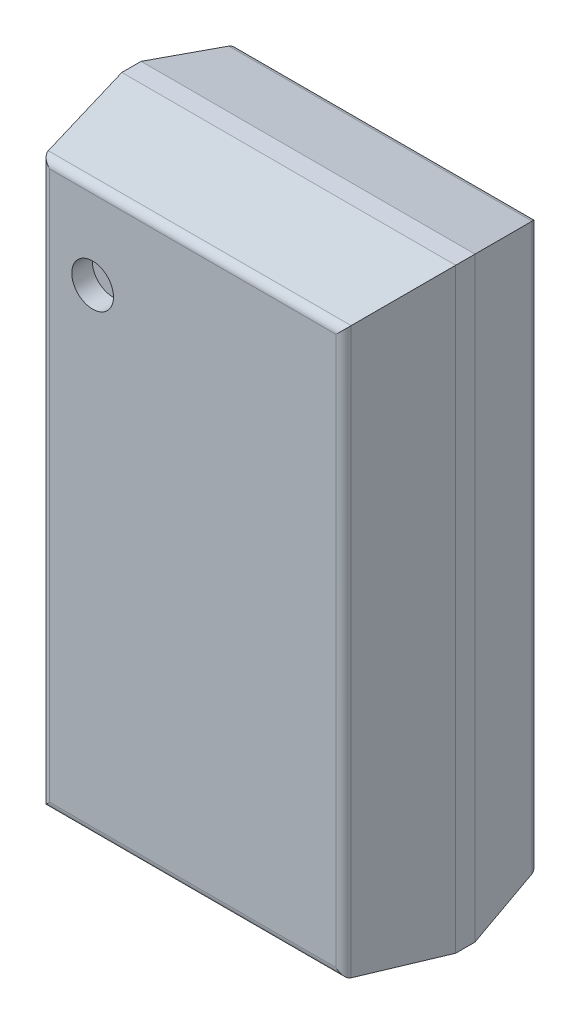
ISO-10303-21;
HEADER;
FILE_DESCRIPTION(('STEP AP214'),'2;1');
FILE_NAME('part.step','',(''),(''),'','','');
FILE_SCHEMA(('AUTOMOTIVE_DESIGN { 1 0 10303 214 1 1 1 1 }'));
ENDSEC;
DATA;
#1=APPLICATION_CONTEXT('core data for automotive mechanical design processes');
#2=APPLICATION_PROTOCOL_DEFINITION('international standard','automotive_design',2000,#1);
#3=PRODUCT_CONTEXT('',#1,'mechanical');
#4=PRODUCT('Part','Part','',(#3));
#5=PRODUCT_RELATED_PRODUCT_CATEGORY('part','',(#4));
#6=PRODUCT_DEFINITION_FORMATION('','',#4);
#7=PRODUCT_DEFINITION_CONTEXT('part definition',#1,'design');
#8=PRODUCT_DEFINITION('design','',#6,#7);
#9=PRODUCT_DEFINITION_SHAPE('','',#8);
#10=(LENGTH_UNIT() NAMED_UNIT(*) SI_UNIT(.MILLI.,.METRE.));
#11=(NAMED_UNIT(*) PLANE_ANGLE_UNIT() SI_UNIT($,.RADIAN.));
#12=(NAMED_UNIT(*) SI_UNIT($,.STERADIAN.) SOLID_ANGLE_UNIT());
#13=UNCERTAINTY_MEASURE_WITH_UNIT(LENGTH_MEASURE(1.E-05),#10,'distance_accuracy_value','');
#14=(GEOMETRIC_REPRESENTATION_CONTEXT(3) GLOBAL_UNCERTAINTY_ASSIGNED_CONTEXT((#13)) GLOBAL_UNIT_ASSIGNED_CONTEXT((#10,
#11,#12)) REPRESENTATION_CONTEXT('',''));
#15=CARTESIAN_POINT('',(0.,0.,0.));
#16=DIRECTION('',(0.,0.,1.));
#17=DIRECTION('',(1.,0.,0.));
#18=AXIS2_PLACEMENT_3D('',#15,#16,#17);
#19=CARTESIAN_POINT('',(-0.771875,-1.45,0.247083911324));
#20=DIRECTION('',(-0.978358092019797,0.,-0.206918930451957));
#21=DIRECTION('',(0.,1.,0.));
#22=AXIS2_PLACEMENT_3D('',#19,#20,#21);
#23=PLANE('',#22);
#24=DIRECTION('',(0.20262661892508,0.20262661892508,-0.958063101578378));
#25=VECTOR('',#24,1.);
#26=CARTESIAN_POINT('',(-0.773542962835,-1.411042962835,0.254970405483));
#27=LINE('',#26,#25);
#28=CARTESIAN_POINT('',(-0.8125,-1.45,0.439167822649));
#29=VERTEX_POINT('',#28);
#30=CARTESIAN_POINT('',(-0.738064175914,-1.375564175914,0.08721891845039));
#31=VERTEX_POINT('',#30);
#32=EDGE_CURVE('E11',#29,#31,#27,.T.);
#33=ORIENTED_EDGE('',*,*,#32,.F.);
#34=DIRECTION('',(0.,1.,0.));
#35=VECTOR('',#34,1.);
#36=CARTESIAN_POINT('',(-0.8125,-1.45,0.439167822649));
#37=LINE('',#36,#35);
#38=CARTESIAN_POINT('',(-0.8125,1.45,0.439167822649));
#39=VERTEX_POINT('',#38);
#40=EDGE_CURVE('E24',#29,#39,#37,.T.);
#41=ORIENTED_EDGE('',*,*,#40,.T.);
#42=DIRECTION('',(0.20262661892508,-0.20262661892508,-0.958063101578378));
#43=VECTOR('',#42,1.);
#44=CARTESIAN_POINT('',(-0.714009520124,1.351509520124,-0.0265167706519));
#45=LINE('',#44,#43);
#46=CARTESIAN_POINT('',(-0.738064175914,1.375564175914,0.08721891845039));
#47=VERTEX_POINT('',#46);
#48=EDGE_CURVE('E223',#39,#47,#45,.T.);
#49=ORIENTED_EDGE('',*,*,#48,.T.);
#50=DIRECTION('',(0.,1.,0.));
#51=VECTOR('',#50,1.);
#52=CARTESIAN_POINT('',(-0.738064175914,-1.36875,0.08721891845039));
#53=LINE('',#52,#51);
#54=EDGE_CURVE('E220',#31,#47,#53,.T.);
#55=ORIENTED_EDGE('',*,*,#54,.F.);
#56=EDGE_LOOP('',(#33,#41,#49,#55));
#57=FACE_BOUND('',#56,.T.);
#58=ADVANCED_FACE('F17',(#57),#23,.T.);
#59=CARTESIAN_POINT('',(-0.8125,-1.409375,0.247083911324));
#60=DIRECTION('',(0.,-0.978358092019797,-0.206918930451957));
#61=DIRECTION('',(-1.,0.,0.));
#62=AXIS2_PLACEMENT_3D('',#59,#60,#61);
#63=PLANE('',#62);
#64=DIRECTION('',(1.,0.,0.));
#65=VECTOR('',#64,1.);
#66=CARTESIAN_POINT('',(-0.73125,-1.375564175914,0.08721891845039));
#67=LINE('',#66,#65);
#68=CARTESIAN_POINT('',(0.738064175914,-1.375564175914,0.08721891845039));
#69=VERTEX_POINT('',#68);
#70=EDGE_CURVE('E218',#31,#69,#67,.T.);
#71=ORIENTED_EDGE('',*,*,#70,.T.);
#72=DIRECTION('',(-0.20262661892508,0.20262661892508,-0.958063101578378));
#73=VECTOR('',#72,1.);
#74=CARTESIAN_POINT('',(0.740183706143,-1.377683706143,0.09724052230414));
#75=LINE('',#74,#73);
#76=CARTESIAN_POINT('',(0.8125,-1.45,0.439167822649));
#77=VERTEX_POINT('',#76);
#78=EDGE_CURVE('E216',#77,#69,#75,.T.);
#79=ORIENTED_EDGE('',*,*,#78,.F.);
#80=DIRECTION('',(1.,0.,0.));
#81=VECTOR('',#80,1.);
#82=CARTESIAN_POINT('',(-0.8125,-1.45,0.439167822649));
#83=LINE('',#82,#81);
#84=EDGE_CURVE('E214',#29,#77,#83,.T.);
#85=ORIENTED_EDGE('',*,*,#84,.F.);
#86=ORIENTED_EDGE('',*,*,#32,.T.);
#87=EDGE_LOOP('',(#71,#79,#85,#86));
#88=FACE_BOUND('',#87,.T.);
#89=ADVANCED_FACE('F279',(#88),#63,.T.);
#90=CARTESIAN_POINT('',(-0.698318378426,-1.36875,0.095625));
#91=DIRECTION('',(0.,1.,0.));
#92=DIRECTION('',(-0.978358092019797,0.,-0.206918930451957));
#93=AXIS2_PLACEMENT_3D('',#90,#91,#92);
#94=CYLINDRICAL_SURFACE('',#93,0.040625);
#95=ORIENTED_EDGE('',*,*,#54,.T.);
#96=CARTESIAN_POINT('',(-0.698318378426,1.335818378426,0.095625));
#97=DIRECTION('',(-0.707106781186548,-0.707106781186548,0.));
#98=DIRECTION('',(-0.707106781186548,0.707106781186548,0.));
#99=AXIS2_PLACEMENT_3D('',#96,#97,#98);
#100=ELLIPSE('',#99,0.05745242597141,0.040625);
#101=CARTESIAN_POINT('',(-0.698318378426,1.335818378426,0.055));
#102=VERTEX_POINT('',#101);
#103=EDGE_CURVE('E212',#47,#102,#100,.T.);
#104=ORIENTED_EDGE('',*,*,#103,.T.);
#105=DIRECTION('',(0.,1.,0.));
#106=VECTOR('',#105,1.);
#107=CARTESIAN_POINT('',(-0.698318378426,-1.36875,0.055));
#108=LINE('',#107,#106);
#109=CARTESIAN_POINT('',(-0.698318378426,-1.335818378426,0.055));
#110=VERTEX_POINT('',#109);
#111=EDGE_CURVE('E209',#110,#102,#108,.T.);
#112=ORIENTED_EDGE('',*,*,#111,.F.);
#113=CARTESIAN_POINT('',(-0.698318378426,-1.335818378426,0.095625));
#114=DIRECTION('',(0.707106781186548,-0.707106781186548,0.));
#115=DIRECTION('',(0.707106781186548,0.707106781186548,0.));
#116=AXIS2_PLACEMENT_3D('',#113,#114,#115);
#117=ELLIPSE('',#116,0.05745242597141,0.040625);
#118=EDGE_CURVE('E206',#31,#110,#117,.T.);
#119=ORIENTED_EDGE('',*,*,#118,.F.);
#120=EDGE_LOOP('',(#95,#104,#112,#119));
#121=FACE_BOUND('',#120,.T.);
#122=ADVANCED_FACE('F255',(#121),#94,.T.);
#123=CARTESIAN_POINT('',(-0.8125,-1.45,0.055));
#124=DIRECTION('',(1.,0.,0.));
#125=DIRECTION('',(0.,0.,1.));
#126=AXIS2_PLACEMENT_3D('',#123,#124,#125);
#127=PLANE('',#126);
#128=DIRECTION('',(0.,1.,0.));
#129=VECTOR('',#128,1.);
#130=CARTESIAN_POINT('',(-0.8125,-1.45,0.532917822649));
#131=LINE('',#130,#129);
#132=CARTESIAN_POINT('',(-0.8125,-1.45,0.532917822649));
#133=VERTEX_POINT('',#132);
#134=CARTESIAN_POINT('',(-0.8125,1.45,0.532917822649));
#135=VERTEX_POINT('',#134);
#136=EDGE_CURVE('E203',#133,#135,#131,.T.);
#137=ORIENTED_EDGE('',*,*,#136,.T.);
#138=DIRECTION('',(0.,0.,1.));
#139=VECTOR('',#138,1.);
#140=CARTESIAN_POINT('',(-0.8125,1.45,0.055));
#141=LINE('',#140,#139);
#142=EDGE_CURVE('E201',#39,#135,#141,.T.);
#143=ORIENTED_EDGE('',*,*,#142,.F.);
#144=ORIENTED_EDGE('',*,*,#40,.F.);
#145=DIRECTION('',(0.,0.,1.));
#146=VECTOR('',#145,1.);
#147=CARTESIAN_POINT('',(-0.8125,-1.45,0.055));
#148=LINE('',#147,#146);
#149=EDGE_CURVE('E199',#29,#133,#148,.T.);
#150=ORIENTED_EDGE('',*,*,#149,.T.);
#151=EDGE_LOOP('',(#137,#143,#144,#150));
#152=FACE_BOUND('',#151,.T.);
#153=ADVANCED_FACE('F232',(#152),#127,.F.);
#154=CARTESIAN_POINT('',(-0.8125,1.409375,0.247083911324));
#155=DIRECTION('',(0.,-0.978358092019797,0.206918930451957));
#156=DIRECTION('',(-1.,0.,0.));
#157=AXIS2_PLACEMENT_3D('',#154,#155,#156);
#158=PLANE('',#157);
#159=ORIENTED_EDGE('',*,*,#48,.F.);
#160=DIRECTION('',(1.,0.,0.));
#161=VECTOR('',#160,1.);
#162=CARTESIAN_POINT('',(-0.8125,1.45,0.439167822649));
#163=LINE('',#162,#161);
#164=CARTESIAN_POINT('',(0.8125,1.45,0.439167822649));
#165=VERTEX_POINT('',#164);
#166=EDGE_CURVE('E197',#39,#165,#163,.T.);
#167=ORIENTED_EDGE('',*,*,#166,.T.);
#168=DIRECTION('',(-0.20262661892508,-0.20262661892508,-0.958063101578378));
#169=VECTOR('',#168,1.);
#170=CARTESIAN_POINT('',(0.680650263432,1.318150263432,-0.184246653831));
#171=LINE('',#170,#169);
#172=CARTESIAN_POINT('',(0.738064175914,1.375564175914,0.08721891845039));
#173=VERTEX_POINT('',#172);
#174=EDGE_CURVE('E195',#165,#173,#171,.T.);
#175=ORIENTED_EDGE('',*,*,#174,.T.);
#176=DIRECTION('',(1.,0.,0.));
#177=VECTOR('',#176,1.);
#178=CARTESIAN_POINT('',(-0.73125,1.375564175914,0.08721891845039));
#179=LINE('',#178,#177);
#180=EDGE_CURVE('E192',#47,#173,#179,.T.);
#181=ORIENTED_EDGE('',*,*,#180,.F.);
#182=EDGE_LOOP('',(#159,#167,#175,#181));
#183=FACE_BOUND('',#182,.T.);
#184=ADVANCED_FACE('F229',(#183),#158,.F.);
#185=CARTESIAN_POINT('',(-0.73125,-1.335818378426,0.095625));
#186=DIRECTION('',(1.,0.,0.));
#187=DIRECTION('',(0.,-0.978358092019797,-0.206918930451957));
#188=AXIS2_PLACEMENT_3D('',#185,#186,#187);
#189=CYLINDRICAL_SURFACE('',#188,0.040625);
#190=ORIENTED_EDGE('',*,*,#118,.T.);
#191=DIRECTION('',(1.,0.,0.));
#192=VECTOR('',#191,1.);
#193=CARTESIAN_POINT('',(-0.73125,-1.335818378426,0.055));
#194=LINE('',#193,#192);
#195=CARTESIAN_POINT('',(0.698318378426,-1.335818378426,0.055));
#196=VERTEX_POINT('',#195);
#197=EDGE_CURVE('E190',#110,#196,#194,.T.);
#198=ORIENTED_EDGE('',*,*,#197,.T.);
#199=CARTESIAN_POINT('',(0.698318378426,-1.335818378426,0.095625));
#200=DIRECTION('',(0.707106781186548,0.707106781186548,0.));
#201=DIRECTION('',(0.707106781186548,-0.707106781186548,0.));
#202=AXIS2_PLACEMENT_3D('',#199,#200,#201);
#203=ELLIPSE('',#202,0.05745242597141,0.040625);
#204=EDGE_CURVE('E187',#69,#196,#203,.T.);
#205=ORIENTED_EDGE('',*,*,#204,.F.);
#206=ORIENTED_EDGE('',*,*,#70,.F.);
#207=EDGE_LOOP('',(#190,#198,#205,#206));
#208=FACE_BOUND('',#207,.T.);
#209=ADVANCED_FACE('F263',(#208),#189,.T.);
#210=CARTESIAN_POINT('',(-0.8125,-1.45,0.055));
#211=DIRECTION('',(0.,1.,0.));
#212=DIRECTION('',(0.,0.,1.));
#213=AXIS2_PLACEMENT_3D('',#210,#211,#212);
#214=PLANE('',#213);
#215=DIRECTION('',(1.,0.,0.));
#216=VECTOR('',#215,1.);
#217=CARTESIAN_POINT('',(-0.8125,-1.45,0.532917822649));
#218=LINE('',#217,#216);
#219=CARTESIAN_POINT('',(0.8125,-1.45,0.532917822649));
#220=VERTEX_POINT('',#219);
#221=EDGE_CURVE('E184',#133,#220,#218,.T.);
#222=ORIENTED_EDGE('',*,*,#221,.F.);
#223=ORIENTED_EDGE('',*,*,#149,.F.);
#224=ORIENTED_EDGE('',*,*,#84,.T.);
#225=DIRECTION('',(0.,0.,1.));
#226=VECTOR('',#225,1.);
#227=CARTESIAN_POINT('',(0.8125,-1.45,0.055));
#228=LINE('',#227,#226);
#229=EDGE_CURVE('E182',#77,#220,#228,.T.);
#230=ORIENTED_EDGE('',*,*,#229,.T.);
#231=EDGE_LOOP('',(#222,#223,#224,#230));
#232=FACE_BOUND('',#231,.T.);
#233=ADVANCED_FACE('F294',(#232),#214,.F.);
#234=CARTESIAN_POINT('',(0.771875,-1.45,0.247083911324));
#235=DIRECTION('',(-0.978358092019797,0.,0.206918930451957));
#236=DIRECTION('',(0.,1.,0.));
#237=AXIS2_PLACEMENT_3D('',#234,#235,#236);
#238=PLANE('',#237);
#239=DIRECTION('',(0.,1.,0.));
#240=VECTOR('',#239,1.);
#241=CARTESIAN_POINT('',(0.738064175914,-1.36875,0.08721891845039));
#242=LINE('',#241,#240);
#243=EDGE_CURVE('E179',#69,#173,#242,.T.);
#244=ORIENTED_EDGE('',*,*,#243,.T.);
#245=ORIENTED_EDGE('',*,*,#174,.F.);
#246=DIRECTION('',(0.,1.,0.));
#247=VECTOR('',#246,1.);
#248=CARTESIAN_POINT('',(0.8125,-1.45,0.439167822649));
#249=LINE('',#248,#247);
#250=EDGE_CURVE('E176',#77,#165,#249,.T.);
#251=ORIENTED_EDGE('',*,*,#250,.F.);
#252=ORIENTED_EDGE('',*,*,#78,.T.);
#253=EDGE_LOOP('',(#244,#245,#251,#252));
#254=FACE_BOUND('',#253,.T.);
#255=ADVANCED_FACE('F246',(#254),#238,.F.);
#256=CARTESIAN_POINT('',(-0.8125,-1.45,0.055));
#257=DIRECTION('',(0.,0.,1.));
#258=DIRECTION('',(1.,0.,0.));
#259=AXIS2_PLACEMENT_3D('',#256,#257,#258);
#260=PLANE('',#259);
#261=DIRECTION('',(1.,0.,0.));
#262=VECTOR('',#261,1.);
#263=CARTESIAN_POINT('',(-0.73125,1.335818378426,0.055));
#264=LINE('',#263,#262);
#265=CARTESIAN_POINT('',(0.698318378426,1.335818378426,0.055));
#266=VERTEX_POINT('',#265);
#267=EDGE_CURVE('E173',#102,#266,#264,.T.);
#268=ORIENTED_EDGE('',*,*,#267,.T.);
#269=DIRECTION('',(0.,1.,0.));
#270=VECTOR('',#269,1.);
#271=CARTESIAN_POINT('',(0.698318378426,-1.36875,0.055));
#272=LINE('',#271,#270);
#273=EDGE_CURVE('E171',#196,#266,#272,.T.);
#274=ORIENTED_EDGE('',*,*,#273,.F.);
#275=ORIENTED_EDGE('',*,*,#197,.F.);
#276=ORIENTED_EDGE('',*,*,#111,.T.);
#277=EDGE_LOOP('',(#268,#274,#275,#276));
#278=FACE_BOUND('',#277,.T.);
#279=ADVANCED_FACE('F259',(#278),#260,.F.);
#280=CARTESIAN_POINT('',(-0.73125,1.335818378426,0.095625));
#281=DIRECTION('',(1.,0.,0.));
#282=DIRECTION('',(0.,0.,-1.));
#283=AXIS2_PLACEMENT_3D('',#280,#281,#282);
#284=CYLINDRICAL_SURFACE('',#283,0.040625);
#285=ORIENTED_EDGE('',*,*,#103,.F.);
#286=ORIENTED_EDGE('',*,*,#180,.T.);
#287=CARTESIAN_POINT('',(0.698318378426,1.335818378426,0.095625));
#288=DIRECTION('',(0.707106781186548,-0.707106781186548,0.));
#289=DIRECTION('',(0.707106781186548,0.707106781186548,0.));
#290=AXIS2_PLACEMENT_3D('',#287,#288,#289);
#291=ELLIPSE('',#290,0.05745242597141,0.040625);
#292=EDGE_CURVE('E168',#266,#173,#291,.T.);
#293=ORIENTED_EDGE('',*,*,#292,.F.);
#294=ORIENTED_EDGE('',*,*,#267,.F.);
#295=EDGE_LOOP('',(#285,#286,#293,#294));
#296=FACE_BOUND('',#295,.T.);
#297=ADVANCED_FACE('F252',(#296),#284,.T.);
#298=CARTESIAN_POINT('',(-0.771875,-1.45,0.766458911324));
#299=DIRECTION('',(0.985205232137967,0.,-0.171378675942994));
#300=DIRECTION('',(0.,1.,0.));
#301=AXIS2_PLACEMENT_3D('',#298,#299,#300);
#302=PLANE('',#301);
#303=DIRECTION('',(0.,1.,0.));
#304=VECTOR('',#303,1.);
#305=CARTESIAN_POINT('',(-0.7371057099,-1.36875,0.96633725871));
#306=LINE('',#305,#304);
#307=CARTESIAN_POINT('',(-0.7371057099,-1.3746057099,0.96633725871));
#308=VERTEX_POINT('',#307);
#309=CARTESIAN_POINT('',(-0.7371057099,1.3746057099,0.96633725871));
#310=VERTEX_POINT('',#309);
#311=EDGE_CURVE('E165',#308,#310,#306,.T.);
#312=ORIENTED_EDGE('',*,*,#311,.T.);
#313=DIRECTION('',(0.16891604038904,-0.16891604038904,0.971048269963227));
#314=VECTOR('',#313,1.);
#315=CARTESIAN_POINT('',(-0.731661826425,1.369161826425,0.997632531899));
#316=LINE('',#315,#314);
#317=EDGE_CURVE('E163',#135,#310,#316,.T.);
#318=ORIENTED_EDGE('',*,*,#317,.F.);
#319=ORIENTED_EDGE('',*,*,#136,.F.);
#320=DIRECTION('',(0.16891604038904,0.16891604038904,0.971048269963227));
#321=VECTOR('',#320,1.);
#322=CARTESIAN_POINT('',(-0.773034138041,-1.410534138041,0.759795370155));
#323=LINE('',#322,#321);
#324=EDGE_CURVE('E161',#133,#308,#323,.T.);
#325=ORIENTED_EDGE('',*,*,#324,.T.);
#326=EDGE_LOOP('',(#312,#318,#319,#325));
#327=FACE_BOUND('',#326,.T.);
#328=ADVANCED_FACE('F276',(#327),#302,.F.);
#329=CARTESIAN_POINT('',(-0.8125,1.45,0.055));
#330=DIRECTION('',(0.,1.,0.));
#331=DIRECTION('',(0.,0.,1.));
#332=AXIS2_PLACEMENT_3D('',#329,#330,#331);
#333=PLANE('',#332);
#334=DIRECTION('',(0.,0.,1.));
#335=VECTOR('',#334,1.);
#336=CARTESIAN_POINT('',(0.8125,1.45,0.055));
#337=LINE('',#336,#335);
#338=CARTESIAN_POINT('',(0.8125,1.45,0.532917822649));
#339=VERTEX_POINT('',#338);
#340=EDGE_CURVE('E159',#165,#339,#337,.T.);
#341=ORIENTED_EDGE('',*,*,#340,.F.);
#342=ORIENTED_EDGE('',*,*,#166,.F.);
#343=ORIENTED_EDGE('',*,*,#142,.T.);
#344=DIRECTION('',(1.,0.,0.));
#345=VECTOR('',#344,1.);
#346=CARTESIAN_POINT('',(-0.8125,1.45,0.532917822649));
#347=LINE('',#346,#345);
#348=EDGE_CURVE('E156',#135,#339,#347,.T.);
#349=ORIENTED_EDGE('',*,*,#348,.T.);
#350=EDGE_LOOP('',(#341,#342,#343,#349));
#351=FACE_BOUND('',#350,.T.);
#352=ADVANCED_FACE('F237',(#351),#333,.T.);
#353=CARTESIAN_POINT('',(0.698318378426,-1.36875,0.095625));
#354=DIRECTION('',(0.,1.,0.));
#355=DIRECTION('',(0.,0.,-1.));
#356=AXIS2_PLACEMENT_3D('',#353,#354,#355);
#357=CYLINDRICAL_SURFACE('',#356,0.040625);
#358=ORIENTED_EDGE('',*,*,#273,.T.);
#359=ORIENTED_EDGE('',*,*,#292,.T.);
#360=ORIENTED_EDGE('',*,*,#243,.F.);
#361=ORIENTED_EDGE('',*,*,#204,.T.);
#362=EDGE_LOOP('',(#358,#359,#360,#361));
#363=FACE_BOUND('',#362,.T.);
#364=ADVANCED_FACE('F266',(#363),#357,.T.);
#365=CARTESIAN_POINT('',(0.8125,-1.45,0.055));
#366=DIRECTION('',(1.,0.,0.));
#367=DIRECTION('',(0.,0.,1.));
#368=AXIS2_PLACEMENT_3D('',#365,#366,#367);
#369=PLANE('',#368);
#370=ORIENTED_EDGE('',*,*,#229,.F.);
#371=ORIENTED_EDGE('',*,*,#250,.T.);
#372=ORIENTED_EDGE('',*,*,#340,.T.);
#373=DIRECTION('',(0.,1.,0.));
#374=VECTOR('',#373,1.);
#375=CARTESIAN_POINT('',(0.8125,-1.45,0.532917822649));
#376=LINE('',#375,#374);
#377=EDGE_CURVE('E153',#220,#339,#376,.T.);
#378=ORIENTED_EDGE('',*,*,#377,.F.);
#379=EDGE_LOOP('',(#370,#371,#372,#378));
#380=FACE_BOUND('',#379,.T.);
#381=ADVANCED_FACE('F242',(#380),#369,.T.);
#382=CARTESIAN_POINT('',(-0.8125,-1.409375,0.766458911324));
#383=DIRECTION('',(0.,0.985205232137967,-0.171378675942994));
#384=DIRECTION('',(-1.,0.,0.));
#385=AXIS2_PLACEMENT_3D('',#382,#383,#384);
#386=PLANE('',#385);
#387=ORIENTED_EDGE('',*,*,#324,.F.);
#388=ORIENTED_EDGE('',*,*,#221,.T.);
#389=DIRECTION('',(-0.16891604038904,0.16891604038904,0.971048269963227));
#390=VECTOR('',#389,1.);
#391=CARTESIAN_POINT('',(0.749851377222,-1.387351377222,0.893066193546));
#392=LINE('',#391,#390);
#393=CARTESIAN_POINT('',(0.7371057099,-1.3746057099,0.96633725871));
#394=VERTEX_POINT('',#393);
#395=EDGE_CURVE('E151',#220,#394,#392,.T.);
#396=ORIENTED_EDGE('',*,*,#395,.T.);
#397=DIRECTION('',(1.,0.,0.));
#398=VECTOR('',#397,1.);
#399=CARTESIAN_POINT('',(-0.73125,-1.3746057099,0.96633725871));
#400=LINE('',#399,#398);
#401=EDGE_CURVE('E148',#308,#394,#400,.T.);
#402=ORIENTED_EDGE('',*,*,#401,.F.);
#403=EDGE_LOOP('',(#387,#388,#396,#402));
#404=FACE_BOUND('',#403,.T.);
#405=ADVANCED_FACE('F274',(#404),#386,.F.);
#406=CARTESIAN_POINT('',(-0.697081747344,-1.36875,0.959375));
#407=DIRECTION('',(0.,1.,0.));
#408=DIRECTION('',(-0.985205232137967,0.,0.171378675942994));
#409=AXIS2_PLACEMENT_3D('',#406,#407,#408);
#410=CYLINDRICAL_SURFACE('',#409,0.040625);
#411=CARTESIAN_POINT('',(-0.697081747344,-1.334581747344,0.959375));
#412=DIRECTION('',(-0.707106781186548,0.707106781186548,0.));
#413=DIRECTION('',(0.707106781186548,0.707106781186548,0.));
#414=AXIS2_PLACEMENT_3D('',#411,#412,#413);
#415=ELLIPSE('',#414,0.05745242597141,0.040625);
#416=CARTESIAN_POINT('',(-0.697081747344,-1.334581747344,1.));
#417=VERTEX_POINT('',#416);
#418=EDGE_CURVE('E146',#308,#417,#415,.T.);
#419=ORIENTED_EDGE('',*,*,#418,.T.);
#420=DIRECTION('',(0.,1.,0.));
#421=VECTOR('',#420,1.);
#422=CARTESIAN_POINT('',(-0.697081747344,-1.36875,1.));
#423=LINE('',#422,#421);
#424=CARTESIAN_POINT('',(-0.697081747344,1.334581747344,1.));
#425=VERTEX_POINT('',#424);
#426=EDGE_CURVE('E144',#417,#425,#423,.T.);
#427=ORIENTED_EDGE('',*,*,#426,.T.);
#428=CARTESIAN_POINT('',(-0.697081747344,1.334581747344,0.959375));
#429=DIRECTION('',(0.707106781186548,0.707106781186548,0.));
#430=DIRECTION('',(-0.707106781186548,0.707106781186548,0.));
#431=AXIS2_PLACEMENT_3D('',#428,#429,#430);
#432=ELLIPSE('',#431,0.05745242597141,0.040625);
#433=EDGE_CURVE('E141',#310,#425,#432,.T.);
#434=ORIENTED_EDGE('',*,*,#433,.F.);
#435=ORIENTED_EDGE('',*,*,#311,.F.);
#436=EDGE_LOOP('',(#419,#427,#434,#435));
#437=FACE_BOUND('',#436,.T.);
#438=ADVANCED_FACE('F314',(#437),#410,.T.);
#439=CARTESIAN_POINT('',(-0.8125,1.409375,0.766458911324));
#440=DIRECTION('',(0.,0.985205232137967,0.171378675942994));
#441=DIRECTION('',(-1.,0.,0.));
#442=AXIS2_PLACEMENT_3D('',#439,#440,#441);
#443=PLANE('',#442);
#444=DIRECTION('',(1.,0.,0.));
#445=VECTOR('',#444,1.);
#446=CARTESIAN_POINT('',(-0.73125,1.3746057099,0.96633725871));
#447=LINE('',#446,#445);
#448=CARTESIAN_POINT('',(0.7371057099,1.3746057099,0.96633725871));
#449=VERTEX_POINT('',#448);
#450=EDGE_CURVE('E138',#310,#449,#447,.T.);
#451=ORIENTED_EDGE('',*,*,#450,.T.);
#452=DIRECTION('',(-0.16891604038904,-0.16891604038904,0.971048269963227));
#453=VECTOR('',#452,1.);
#454=CARTESIAN_POINT('',(0.708479065605,1.345979065605,1.13090335529));
#455=LINE('',#454,#453);
#456=EDGE_CURVE('E136',#339,#449,#455,.T.);
#457=ORIENTED_EDGE('',*,*,#456,.F.);
#458=ORIENTED_EDGE('',*,*,#348,.F.);
#459=ORIENTED_EDGE('',*,*,#317,.T.);
#460=EDGE_LOOP('',(#451,#457,#458,#459));
#461=FACE_BOUND('',#460,.T.);
#462=ADVANCED_FACE('F322',(#461),#443,.T.);
#463=CARTESIAN_POINT('',(0.771875,-1.45,0.766458911324));
#464=DIRECTION('',(0.985205232137967,0.,0.171378675942994));
#465=DIRECTION('',(0.,1.,0.));
#466=AXIS2_PLACEMENT_3D('',#463,#464,#465);
#467=PLANE('',#466);
#468=ORIENTED_EDGE('',*,*,#395,.F.);
#469=ORIENTED_EDGE('',*,*,#377,.T.);
#470=ORIENTED_EDGE('',*,*,#456,.T.);
#471=DIRECTION('',(0.,1.,0.));
#472=VECTOR('',#471,1.);
#473=CARTESIAN_POINT('',(0.7371057099,-1.36875,0.96633725871));
#474=LINE('',#473,#472);
#475=EDGE_CURVE('E133',#394,#449,#474,.T.);
#476=ORIENTED_EDGE('',*,*,#475,.F.);
#477=EDGE_LOOP('',(#468,#469,#470,#476));
#478=FACE_BOUND('',#477,.T.);
#479=ADVANCED_FACE('F329',(#478),#467,.T.);
#480=CARTESIAN_POINT('',(-0.73125,-1.334581747344,0.959375));
#481=DIRECTION('',(1.,0.,0.));
#482=DIRECTION('',(0.,-0.985205232137967,0.171378675942994));
#483=AXIS2_PLACEMENT_3D('',#480,#481,#482);
#484=CYLINDRICAL_SURFACE('',#483,0.040625);
#485=ORIENTED_EDGE('',*,*,#401,.T.);
#486=CARTESIAN_POINT('',(0.697081747344,-1.334581747344,0.959375));
#487=DIRECTION('',(-0.707106781186548,-0.707106781186548,0.));
#488=DIRECTION('',(0.707106781186548,-0.707106781186548,0.));
#489=AXIS2_PLACEMENT_3D('',#486,#487,#488);
#490=ELLIPSE('',#489,0.05745242597141,0.040625);
#491=CARTESIAN_POINT('',(0.697081747344,-1.334581747344,1.));
#492=VERTEX_POINT('',#491);
#493=EDGE_CURVE('E131',#394,#492,#490,.T.);
#494=ORIENTED_EDGE('',*,*,#493,.T.);
#495=DIRECTION('',(1.,0.,0.));
#496=VECTOR('',#495,1.);
#497=CARTESIAN_POINT('',(-0.73125,-1.334581747344,1.));
#498=LINE('',#497,#496);
#499=EDGE_CURVE('E128',#417,#492,#498,.T.);
#500=ORIENTED_EDGE('',*,*,#499,.F.);
#501=ORIENTED_EDGE('',*,*,#418,.F.);
#502=EDGE_LOOP('',(#485,#494,#500,#501));
#503=FACE_BOUND('',#502,.T.);
#504=ADVANCED_FACE('F334',(#503),#484,.T.);
#505=CARTESIAN_POINT('',(-0.8125,-1.45,1.));
#506=DIRECTION('',(0.,0.,1.));
#507=DIRECTION('',(1.,0.,0.));
#508=AXIS2_PLACEMENT_3D('',#505,#506,#507);
#509=PLANE('',#508);
#510=ORIENTED_EDGE('',*,*,#426,.F.);
#511=ORIENTED_EDGE('',*,*,#499,.T.);
#512=DIRECTION('',(0.,1.,0.));
#513=VECTOR('',#512,1.);
#514=CARTESIAN_POINT('',(0.697081747344,-1.36875,1.));
#515=LINE('',#514,#513);
#516=CARTESIAN_POINT('',(0.697081747344,1.334581747344,1.));
#517=VERTEX_POINT('',#516);
#518=EDGE_CURVE('E126',#492,#517,#515,.T.);
#519=ORIENTED_EDGE('',*,*,#518,.T.);
#520=DIRECTION('',(1.,0.,0.));
#521=VECTOR('',#520,1.);
#522=CARTESIAN_POINT('',(-0.73125,1.334581747344,1.));
#523=LINE('',#522,#521);
#524=EDGE_CURVE('E123',#425,#517,#523,.T.);
#525=ORIENTED_EDGE('',*,*,#524,.F.);
#526=EDGE_LOOP('',(#510,#511,#519,#525));
#527=FACE_BOUND('',#526,.T.);
#528=CARTESIAN_POINT('',(-0.4875,0.95,1.));
#529=DIRECTION('',(0.,0.,1.));
#530=DIRECTION('',(1.,0.,0.));
#531=AXIS2_PLACEMENT_3D('',#528,#529,#530);
#532=CIRCLE('',#531,0.1015625);
#533=CARTESIAN_POINT('',(-0.3859375,0.95,1.));
#534=VERTEX_POINT('',#533);
#535=EDGE_CURVE('E113',#534,#534,#532,.T.);
#536=ORIENTED_EDGE('',*,*,#535,.F.);
#537=EDGE_LOOP('',(#536));
#538=FACE_BOUND('',#537,.T.);
#539=ADVANCED_FACE('F337',(#527,#538),#509,.T.);
#540=CARTESIAN_POINT('',(-0.73125,1.334581747344,0.959375));
#541=DIRECTION('',(1.,0.,0.));
#542=DIRECTION('',(0.,0.,1.));
#543=AXIS2_PLACEMENT_3D('',#540,#541,#542);
#544=CYLINDRICAL_SURFACE('',#543,0.040625);
#545=ORIENTED_EDGE('',*,*,#524,.T.);
#546=CARTESIAN_POINT('',(0.697081747344,1.334581747344,0.959375));
#547=DIRECTION('',(-0.707106781186548,0.707106781186548,0.));
#548=DIRECTION('',(0.707106781186548,0.707106781186548,0.));
#549=AXIS2_PLACEMENT_3D('',#546,#547,#548);
#550=ELLIPSE('',#549,0.05745242597141,0.040625);
#551=EDGE_CURVE('E117',#517,#449,#550,.T.);
#552=ORIENTED_EDGE('',*,*,#551,.T.);
#553=ORIENTED_EDGE('',*,*,#450,.F.);
#554=ORIENTED_EDGE('',*,*,#433,.T.);
#555=EDGE_LOOP('',(#545,#552,#553,#554));
#556=FACE_BOUND('',#555,.T.);
#557=ADVANCED_FACE('F318',(#556),#544,.T.);
#558=CARTESIAN_POINT('',(0.697081747344,-1.36875,0.959375));
#559=DIRECTION('',(0.,1.,0.));
#560=DIRECTION('',(0.,0.,1.));
#561=AXIS2_PLACEMENT_3D('',#558,#559,#560);
#562=CYLINDRICAL_SURFACE('',#561,0.040625);
#563=ORIENTED_EDGE('',*,*,#493,.F.);
#564=ORIENTED_EDGE('',*,*,#475,.T.);
#565=ORIENTED_EDGE('',*,*,#551,.F.);
#566=ORIENTED_EDGE('',*,*,#518,.F.);
#567=EDGE_LOOP('',(#563,#564,#565,#566));
#568=FACE_BOUND('',#567,.T.);
#569=ADVANCED_FACE('F326',(#568),#562,.T.);
#570=CARTESIAN_POINT('',(-0.4875,0.95,0.9));
#571=DIRECTION('',(0.,0.,1.));
#572=DIRECTION('',(1.,0.,0.));
#573=AXIS2_PLACEMENT_3D('',#570,#571,#572);
#574=CYLINDRICAL_SURFACE('',#573,0.1015625);
#575=CARTESIAN_POINT('',(-0.4875,0.95,0.9));
#576=DIRECTION('',(0.,0.,1.));
#577=DIRECTION('',(1.,0.,0.));
#578=AXIS2_PLACEMENT_3D('',#575,#576,#577);
#579=CIRCLE('',#578,0.1015625);
#580=CARTESIAN_POINT('',(-0.3859375,0.95,0.9));
#581=VERTEX_POINT('',#580);
#582=EDGE_CURVE('E111',#581,#581,#579,.T.);
#583=ORIENTED_EDGE('',*,*,#582,.F.);
#584=DIRECTION('',(0.,0.,1.));
#585=VECTOR('',#584,1.);
#586=CARTESIAN_POINT('',(-0.3859375,0.95,0.9));
#587=LINE('',#586,#585);
#588=EDGE_CURVE('E108',#581,#534,#587,.T.);
#589=ORIENTED_EDGE('',*,*,#588,.T.);
#590=ORIENTED_EDGE('',*,*,#535,.T.);
#591=ORIENTED_EDGE('',*,*,#588,.F.);
#592=EDGE_LOOP('',(#583,#589,#590,#591));
#593=FACE_BOUND('',#592,.T.);
#594=ADVANCED_FACE('F110',(#593),#574,.F.);
#595=CARTESIAN_POINT('',(-0.4875,0.95,0.9));
#596=DIRECTION('',(0.,0.,1.));
#597=DIRECTION('',(1.,0.,0.));
#598=AXIS2_PLACEMENT_3D('',#595,#596,#597);
#599=PLANE('',#598);
#600=ORIENTED_EDGE('',*,*,#582,.T.);
#601=EDGE_LOOP('',(#600));
#602=FACE_BOUND('',#601,.T.);
#603=ADVANCED_FACE('F116',(#602),#599,.T.);
#604=CLOSED_SHELL('',(#58,#89,#122,#153,#184,#209,#233,#255,#279,#297,#328,#352,#364,#381,#405,
#438,#462,#479,#504,#539,#557,#569,#594,#603));
#605=MANIFOLD_SOLID_BREP('B1',#604);
#606=ADVANCED_BREP_SHAPE_REPRESENTATION('',(#18,#605),#14);
#607=SHAPE_DEFINITION_REPRESENTATION(#9,#606);
ENDSEC;
END-ISO-10303-21;
